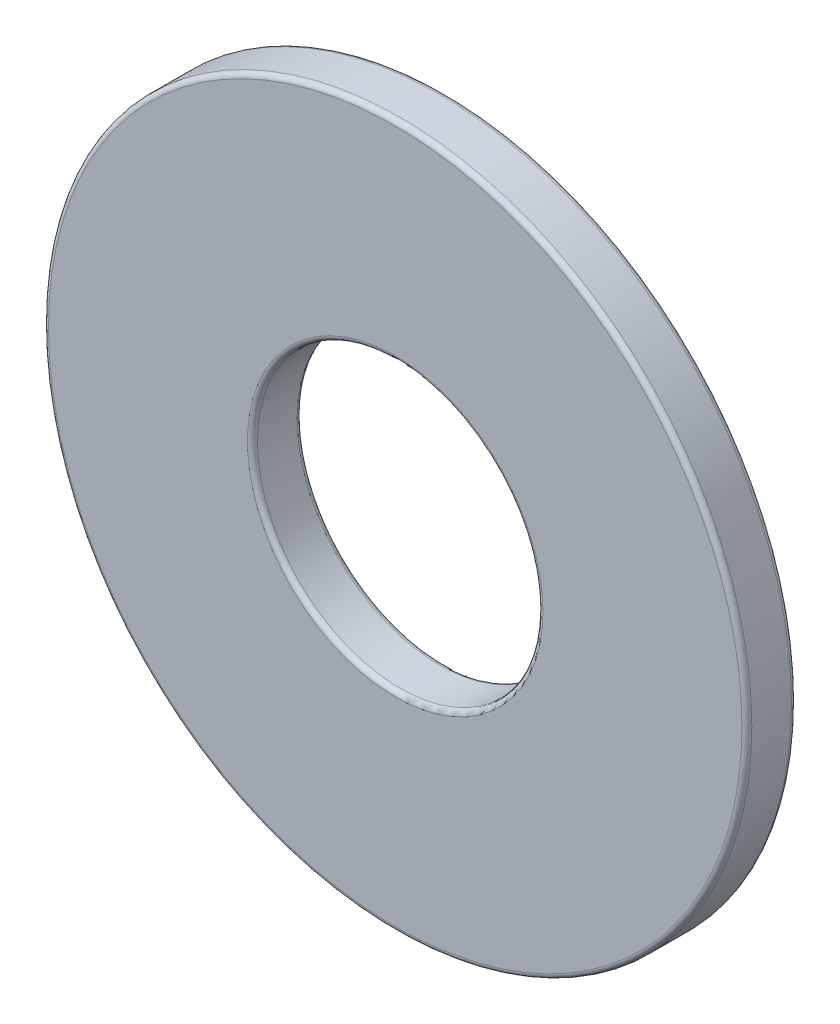
ISO-10303-21;
HEADER;
FILE_DESCRIPTION(('STEP AP214'),'2;1');
FILE_NAME('part.step','',(''),(''),'','','');
FILE_SCHEMA(('AUTOMOTIVE_DESIGN { 1 0 10303 214 1 1 1 1 }'));
ENDSEC;
DATA;
#1=APPLICATION_CONTEXT('core data for automotive mechanical design processes');
#2=APPLICATION_PROTOCOL_DEFINITION('international standard','automotive_design',2000,#1);
#3=PRODUCT_CONTEXT('',#1,'mechanical');
#4=PRODUCT('Part','Part','',(#3));
#5=PRODUCT_RELATED_PRODUCT_CATEGORY('part','',(#4));
#6=PRODUCT_DEFINITION_FORMATION('','',#4);
#7=PRODUCT_DEFINITION_CONTEXT('part definition',#1,'design');
#8=PRODUCT_DEFINITION('design','',#6,#7);
#9=PRODUCT_DEFINITION_SHAPE('','',#8);
#10=(LENGTH_UNIT() NAMED_UNIT(*) SI_UNIT(.MILLI.,.METRE.));
#11=(NAMED_UNIT(*) PLANE_ANGLE_UNIT() SI_UNIT($,.RADIAN.));
#12=(NAMED_UNIT(*) SI_UNIT($,.STERADIAN.) SOLID_ANGLE_UNIT());
#13=UNCERTAINTY_MEASURE_WITH_UNIT(LENGTH_MEASURE(1.E-05),#10,'distance_accuracy_value','');
#14=(GEOMETRIC_REPRESENTATION_CONTEXT(3) GLOBAL_UNCERTAINTY_ASSIGNED_CONTEXT((#13)) GLOBAL_UNIT_ASSIGNED_CONTEXT((#10,
#11,#12)) REPRESENTATION_CONTEXT('',''));
#15=CARTESIAN_POINT('',(0.,0.,0.));
#16=DIRECTION('',(0.,0.,1.));
#17=DIRECTION('',(1.,0.,0.));
#18=AXIS2_PLACEMENT_3D('',#15,#16,#17);
#19=CARTESIAN_POINT('',(0.,0.,-1.7907));
#20=DIRECTION('',(0.,0.,1.));
#21=DIRECTION('',(1.,0.,0.));
#22=AXIS2_PLACEMENT_3D('',#19,#20,#21);
#23=CYLINDRICAL_SURFACE('',#22,25.4);
#24=CARTESIAN_POINT('',(0.,0.,-1.43256));
#25=DIRECTION('',(0.,0.,1.));
#26=DIRECTION('',(1.,0.,0.));
#27=AXIS2_PLACEMENT_3D('',#24,#25,#26);
#28=CIRCLE('',#27,25.4);
#29=CARTESIAN_POINT('',(25.4,0.,-1.43256));
#30=VERTEX_POINT('',#29);
#31=EDGE_CURVE('E63',#30,#30,#28,.T.);
#32=CARTESIAN_POINT('',(0.,0.,1.43256));
#33=DIRECTION('',(0.,0.,1.));
#34=DIRECTION('',(1.,0.,0.));
#35=AXIS2_PLACEMENT_3D('',#32,#33,#34);
#36=CIRCLE('',#35,25.4);
#37=CARTESIAN_POINT('',(25.4,0.,1.43256));
#38=VERTEX_POINT('',#37);
#39=EDGE_CURVE('E66',#38,#38,#36,.F.);
#40=CARTESIAN_POINT('',(25.4,0.,-1.43256));
#41=CARTESIAN_POINT('',(25.4,0.,-1.402715));
#42=CARTESIAN_POINT('',(25.4,0.,-1.37287));
#43=CARTESIAN_POINT('',(25.4,0.,-1.31318));
#44=CARTESIAN_POINT('',(25.4,0.,-1.283335));
#45=CARTESIAN_POINT('',(25.4,0.,-1.223645));
#46=CARTESIAN_POINT('',(25.4,0.,-1.1938));
#47=CARTESIAN_POINT('',(25.4,0.,-1.13411));
#48=CARTESIAN_POINT('',(25.4,0.,-1.104265));
#49=CARTESIAN_POINT('',(25.4,0.,-1.044575));
#50=CARTESIAN_POINT('',(25.4,0.,-1.01473));
#51=CARTESIAN_POINT('',(25.4,0.,-0.955040000000003));
#52=CARTESIAN_POINT('',(25.4,0.,-0.925195000000003));
#53=CARTESIAN_POINT('',(25.4,0.,-0.865505000000003));
#54=CARTESIAN_POINT('',(25.4,0.,-0.835660000000003));
#55=CARTESIAN_POINT('',(25.4,0.,-0.775970000000003));
#56=CARTESIAN_POINT('',(25.4,0.,-0.746125000000003));
#57=CARTESIAN_POINT('',(25.4,0.,-0.686435000000003));
#58=CARTESIAN_POINT('',(25.4,0.,-0.656590000000003));
#59=CARTESIAN_POINT('',(25.4,0.,-0.596900000000003));
#60=CARTESIAN_POINT('',(25.4,0.,-0.567055000000003));
#61=CARTESIAN_POINT('',(25.4,0.,-0.507365000000003));
#62=CARTESIAN_POINT('',(25.4,0.,-0.477520000000003));
#63=CARTESIAN_POINT('',(25.4,0.,-0.417830000000003));
#64=CARTESIAN_POINT('',(25.4,0.,-0.387985000000003));
#65=CARTESIAN_POINT('',(25.4,0.,-0.328295000000003));
#66=CARTESIAN_POINT('',(25.4,0.,-0.298450000000003));
#67=CARTESIAN_POINT('',(25.4,0.,-0.238760000000003));
#68=CARTESIAN_POINT('',(25.4,0.,-0.208915000000003));
#69=CARTESIAN_POINT('',(25.4,0.,-0.149225000000003));
#70=CARTESIAN_POINT('',(25.4,0.,-0.119380000000003));
#71=CARTESIAN_POINT('',(25.4,0.,-0.0596900000000028));
#72=CARTESIAN_POINT('',(25.4,0.,-0.0298450000000028));
#73=CARTESIAN_POINT('',(25.4,0.,0.0298449999999972));
#74=CARTESIAN_POINT('',(25.4,0.,0.0596899999999972));
#75=CARTESIAN_POINT('',(25.4,0.,0.119379999999997));
#76=CARTESIAN_POINT('',(25.4,0.,0.149224999999997));
#77=CARTESIAN_POINT('',(25.4,0.,0.208914999999997));
#78=CARTESIAN_POINT('',(25.4,0.,0.238759999999997));
#79=CARTESIAN_POINT('',(25.4,0.,0.298449999999997));
#80=CARTESIAN_POINT('',(25.4,0.,0.328294999999997));
#81=CARTESIAN_POINT('',(25.4,0.,0.387984999999997));
#82=CARTESIAN_POINT('',(25.4,0.,0.417829999999997));
#83=CARTESIAN_POINT('',(25.4,0.,0.477519999999997));
#84=CARTESIAN_POINT('',(25.4,0.,0.507364999999997));
#85=CARTESIAN_POINT('',(25.4,0.,0.567054999999997));
#86=CARTESIAN_POINT('',(25.4,0.,0.596899999999997));
#87=CARTESIAN_POINT('',(25.4,0.,0.656589999999997));
#88=CARTESIAN_POINT('',(25.4,0.,0.686434999999997));
#89=CARTESIAN_POINT('',(25.4,0.,0.746124999999997));
#90=CARTESIAN_POINT('',(25.4,0.,0.775969999999997));
#91=CARTESIAN_POINT('',(25.4,0.,0.835659999999997));
#92=CARTESIAN_POINT('',(25.4,0.,0.865504999999997));
#93=CARTESIAN_POINT('',(25.4,0.,0.925194999999997));
#94=CARTESIAN_POINT('',(25.4,0.,0.955039999999997));
#95=CARTESIAN_POINT('',(25.4,0.,1.01473));
#96=CARTESIAN_POINT('',(25.4,0.,1.044575));
#97=CARTESIAN_POINT('',(25.4,0.,1.104265));
#98=CARTESIAN_POINT('',(25.4,0.,1.13411));
#99=CARTESIAN_POINT('',(25.4,0.,1.1938));
#100=CARTESIAN_POINT('',(25.4,0.,1.223645));
#101=CARTESIAN_POINT('',(25.4,0.,1.283335));
#102=CARTESIAN_POINT('',(25.4,0.,1.31318));
#103=CARTESIAN_POINT('',(25.4,0.,1.37287));
#104=CARTESIAN_POINT('',(25.4,0.,1.402715));
#105=CARTESIAN_POINT('',(25.4,0.,1.43256));
#106=B_SPLINE_CURVE_WITH_KNOTS('',3,(#40,#41,#42,#43,#44,#45,#46,#47,#48,#49,#50,#51,#52,#53,
#54,#55,#56,#57,#58,#59,#60,#61,#62,#63,#64,#65,#66,#67,#68,#69,#70,#71,#72,#73,#74,#75,#76,#77,
#78,#79,#80,#81,#82,#83,#84,#85,#86,#87,#88,#89,#90,#91,#92,#93,#94,#95,#96,#97,#98,#99,#100,
#101,#102,#103,#104,#105),.UNSPECIFIED.,.F.,.F.,(4,2,2,2,2,2,2,2,2,2,2,2,2,2,2,2,2,2,2,2,2,2,2,
2,2,2,2,2,2,2,2,2,4),(0.,0.089535,0.17907,0.268605,0.35814,0.447675,0.53721,0.626745,0.71628,
0.805815,0.89535,0.984885,1.07442,1.163955,1.25349,1.343025,1.43256,1.522095,1.61163,1.701165,
1.7907,1.880235,1.96977,2.059305,2.14884,2.238375,2.32791,2.417445,2.50698,2.596515,2.68605,
2.775585,2.86512),.UNSPECIFIED.);
#107=EDGE_CURVE('BSEAM37',#30,#38,#106,.T.);
#108=ORIENTED_EDGE('',*,*,#31,.T.);
#109=ORIENTED_EDGE('',*,*,#39,.T.);
#110=ORIENTED_EDGE('',*,*,#107,.T.);
#111=ORIENTED_EDGE('',*,*,#107,.F.);
#112=EDGE_LOOP('',(#108,#110,#109,#111));
#113=FACE_BOUND('',#112,.T.);
#114=ADVANCED_FACE('F37',(#113),#23,.T.);
#115=CARTESIAN_POINT('',(0.,0.,-1.7907));
#116=DIRECTION('',(0.,0.,1.));
#117=DIRECTION('',(1.,0.,0.));
#118=AXIS2_PLACEMENT_3D('',#115,#116,#117);
#119=PLANE('',#118);
#120=CARTESIAN_POINT('',(0.,0.,-1.7907));
#121=DIRECTION('',(0.,0.,1.));
#122=DIRECTION('',(1.,0.,0.));
#123=AXIS2_PLACEMENT_3D('',#120,#121,#122);
#124=CIRCLE('',#123,25.04186);
#125=CARTESIAN_POINT('',(25.04186,0.,-1.7907));
#126=VERTEX_POINT('',#125);
#127=EDGE_CURVE('E57',#126,#126,#124,.F.);
#128=ORIENTED_EDGE('',*,*,#127,.T.);
#129=EDGE_LOOP('',(#128));
#130=FACE_BOUND('',#129,.T.);
#131=CARTESIAN_POINT('',(0.,0.,-1.7907));
#132=DIRECTION('',(0.,0.,1.));
#133=DIRECTION('',(1.,0.,0.));
#134=AXIS2_PLACEMENT_3D('',#131,#132,#133);
#135=CIRCLE('',#134,10.67054);
#136=CARTESIAN_POINT('',(10.67054,0.,-1.7907));
#137=VERTEX_POINT('',#136);
#138=EDGE_CURVE('E60',#137,#137,#135,.T.);
#139=ORIENTED_EDGE('',*,*,#138,.T.);
#140=EDGE_LOOP('',(#139));
#141=FACE_BOUND('',#140,.T.);
#142=ADVANCED_FACE('F80',(#130,#141),#119,.F.);
#143=CARTESIAN_POINT('',(0.,0.,-1.7907));
#144=DIRECTION('',(0.,0.,1.));
#145=DIRECTION('',(1.,0.,0.));
#146=AXIS2_PLACEMENT_3D('',#143,#144,#145);
#147=CYLINDRICAL_SURFACE('',#146,10.3124);
#148=CARTESIAN_POINT('',(0.,0.,-1.43256));
#149=DIRECTION('',(0.,0.,1.));
#150=DIRECTION('',(1.,0.,0.));
#151=AXIS2_PLACEMENT_3D('',#148,#149,#150);
#152=CIRCLE('',#151,10.3124);
#153=CARTESIAN_POINT('',(10.3124,0.,-1.43256));
#154=VERTEX_POINT('',#153);
#155=EDGE_CURVE('E48',#154,#154,#152,.F.);
#156=CARTESIAN_POINT('',(0.,0.,1.43256));
#157=DIRECTION('',(0.,0.,1.));
#158=DIRECTION('',(1.,0.,0.));
#159=AXIS2_PLACEMENT_3D('',#156,#157,#158);
#160=CIRCLE('',#159,10.3124);
#161=CARTESIAN_POINT('',(10.3124,0.,1.43256));
#162=VERTEX_POINT('',#161);
#163=EDGE_CURVE('E52',#162,#162,#160,.T.);
#164=CARTESIAN_POINT('',(10.3124,0.,-1.43256));
#165=CARTESIAN_POINT('',(10.3124,0.,-1.402715));
#166=CARTESIAN_POINT('',(10.3124,0.,-1.37287));
#167=CARTESIAN_POINT('',(10.3124,0.,-1.31318));
#168=CARTESIAN_POINT('',(10.3124,0.,-1.283335));
#169=CARTESIAN_POINT('',(10.3124,0.,-1.223645));
#170=CARTESIAN_POINT('',(10.3124,0.,-1.1938));
#171=CARTESIAN_POINT('',(10.3124,0.,-1.13411));
#172=CARTESIAN_POINT('',(10.3124,0.,-1.104265));
#173=CARTESIAN_POINT('',(10.3124,0.,-1.044575));
#174=CARTESIAN_POINT('',(10.3124,0.,-1.01473));
#175=CARTESIAN_POINT('',(10.3124,0.,-0.955040000000003));
#176=CARTESIAN_POINT('',(10.3124,0.,-0.925195000000003));
#177=CARTESIAN_POINT('',(10.3124,0.,-0.865505000000003));
#178=CARTESIAN_POINT('',(10.3124,0.,-0.835660000000003));
#179=CARTESIAN_POINT('',(10.3124,0.,-0.775970000000003));
#180=CARTESIAN_POINT('',(10.3124,0.,-0.746125000000003));
#181=CARTESIAN_POINT('',(10.3124,0.,-0.686435000000003));
#182=CARTESIAN_POINT('',(10.3124,0.,-0.656590000000003));
#183=CARTESIAN_POINT('',(10.3124,0.,-0.596900000000003));
#184=CARTESIAN_POINT('',(10.3124,0.,-0.567055000000003));
#185=CARTESIAN_POINT('',(10.3124,0.,-0.507365000000003));
#186=CARTESIAN_POINT('',(10.3124,0.,-0.477520000000003));
#187=CARTESIAN_POINT('',(10.3124,0.,-0.417830000000003));
#188=CARTESIAN_POINT('',(10.3124,0.,-0.387985000000003));
#189=CARTESIAN_POINT('',(10.3124,0.,-0.328295000000003));
#190=CARTESIAN_POINT('',(10.3124,0.,-0.298450000000003));
#191=CARTESIAN_POINT('',(10.3124,0.,-0.238760000000003));
#192=CARTESIAN_POINT('',(10.3124,0.,-0.208915000000003));
#193=CARTESIAN_POINT('',(10.3124,0.,-0.149225000000003));
#194=CARTESIAN_POINT('',(10.3124,0.,-0.119380000000003));
#195=CARTESIAN_POINT('',(10.3124,0.,-0.0596900000000028));
#196=CARTESIAN_POINT('',(10.3124,0.,-0.0298450000000028));
#197=CARTESIAN_POINT('',(10.3124,0.,0.0298449999999972));
#198=CARTESIAN_POINT('',(10.3124,0.,0.0596899999999972));
#199=CARTESIAN_POINT('',(10.3124,0.,0.119379999999997));
#200=CARTESIAN_POINT('',(10.3124,0.,0.149224999999997));
#201=CARTESIAN_POINT('',(10.3124,0.,0.208914999999997));
#202=CARTESIAN_POINT('',(10.3124,0.,0.238759999999997));
#203=CARTESIAN_POINT('',(10.3124,0.,0.298449999999997));
#204=CARTESIAN_POINT('',(10.3124,0.,0.328294999999997));
#205=CARTESIAN_POINT('',(10.3124,0.,0.387984999999997));
#206=CARTESIAN_POINT('',(10.3124,0.,0.417829999999997));
#207=CARTESIAN_POINT('',(10.3124,0.,0.477519999999997));
#208=CARTESIAN_POINT('',(10.3124,0.,0.507364999999997));
#209=CARTESIAN_POINT('',(10.3124,0.,0.567054999999997));
#210=CARTESIAN_POINT('',(10.3124,0.,0.596899999999997));
#211=CARTESIAN_POINT('',(10.3124,0.,0.656589999999997));
#212=CARTESIAN_POINT('',(10.3124,0.,0.686434999999997));
#213=CARTESIAN_POINT('',(10.3124,0.,0.746124999999997));
#214=CARTESIAN_POINT('',(10.3124,0.,0.775969999999997));
#215=CARTESIAN_POINT('',(10.3124,0.,0.835659999999997));
#216=CARTESIAN_POINT('',(10.3124,0.,0.865504999999997));
#217=CARTESIAN_POINT('',(10.3124,0.,0.925194999999997));
#218=CARTESIAN_POINT('',(10.3124,0.,0.955039999999997));
#219=CARTESIAN_POINT('',(10.3124,0.,1.01473));
#220=CARTESIAN_POINT('',(10.3124,0.,1.044575));
#221=CARTESIAN_POINT('',(10.3124,0.,1.104265));
#222=CARTESIAN_POINT('',(10.3124,0.,1.13411));
#223=CARTESIAN_POINT('',(10.3124,0.,1.1938));
#224=CARTESIAN_POINT('',(10.3124,0.,1.223645));
#225=CARTESIAN_POINT('',(10.3124,0.,1.283335));
#226=CARTESIAN_POINT('',(10.3124,0.,1.31318));
#227=CARTESIAN_POINT('',(10.3124,0.,1.37287));
#228=CARTESIAN_POINT('',(10.3124,0.,1.402715));
#229=CARTESIAN_POINT('',(10.3124,0.,1.43256));
#230=B_SPLINE_CURVE_WITH_KNOTS('',3,(#164,#165,#166,#167,#168,#169,#170,#171,#172,#173,#174,
#175,#176,#177,#178,#179,#180,#181,#182,#183,#184,#185,#186,#187,#188,#189,#190,#191,#192,#193,
#194,#195,#196,#197,#198,#199,#200,#201,#202,#203,#204,#205,#206,#207,#208,#209,#210,#211,#212,
#213,#214,#215,#216,#217,#218,#219,#220,#221,#222,#223,#224,#225,#226,#227,#228,#229),
.UNSPECIFIED.,.F.,.F.,(4,2,2,2,2,2,2,2,2,2,2,2,2,2,2,2,2,2,2,2,2,2,2,2,2,2,2,2,2,2,2,2,4),(0.,
0.089535,0.17907,0.268605,0.35814,0.447675,0.53721,0.626745,0.71628,0.805815,0.89535,0.984885,
1.07442,1.163955,1.25349,1.343025,1.43256,1.522095,1.61163,1.701165,1.7907,1.880235,1.96977,
2.059305,2.14884,2.238375,2.32791,2.417445,2.50698,2.596515,2.68605,2.775585,2.86512),.UNSPECIFIED.);
#231=EDGE_CURVE('BSEAM86',#154,#162,#230,.T.);
#232=ORIENTED_EDGE('',*,*,#155,.T.);
#233=ORIENTED_EDGE('',*,*,#163,.T.);
#234=ORIENTED_EDGE('',*,*,#231,.T.);
#235=ORIENTED_EDGE('',*,*,#231,.F.);
#236=EDGE_LOOP('',(#232,#234,#233,#235));
#237=FACE_BOUND('',#236,.T.);
#238=ADVANCED_FACE('F86',(#237),#147,.F.);
#239=CARTESIAN_POINT('',(0.,0.,1.7907));
#240=DIRECTION('',(0.,0.,1.));
#241=DIRECTION('',(1.,0.,0.));
#242=AXIS2_PLACEMENT_3D('',#239,#240,#241);
#243=PLANE('',#242);
#244=CARTESIAN_POINT('',(0.,0.,1.7907));
#245=DIRECTION('',(0.,0.,1.));
#246=DIRECTION('',(1.,0.,0.));
#247=AXIS2_PLACEMENT_3D('',#244,#245,#246);
#248=CIRCLE('',#247,10.67054);
#249=CARTESIAN_POINT('',(10.67054,0.,1.7907));
#250=VERTEX_POINT('',#249);
#251=EDGE_CURVE('E10',#250,#250,#248,.F.);
#252=ORIENTED_EDGE('',*,*,#251,.T.);
#253=EDGE_LOOP('',(#252));
#254=FACE_BOUND('',#253,.T.);
#255=CARTESIAN_POINT('',(0.,0.,1.7907));
#256=DIRECTION('',(0.,0.,1.));
#257=DIRECTION('',(1.,0.,0.));
#258=AXIS2_PLACEMENT_3D('',#255,#256,#257);
#259=CIRCLE('',#258,25.04186);
#260=CARTESIAN_POINT('',(25.04186,0.,1.7907));
#261=VERTEX_POINT('',#260);
#262=EDGE_CURVE('E44',#261,#261,#259,.T.);
#263=ORIENTED_EDGE('',*,*,#262,.T.);
#264=EDGE_LOOP('',(#263));
#265=FACE_BOUND('',#264,.T.);
#266=ADVANCED_FACE('F94',(#254,#265),#243,.T.);
#267=CARTESIAN_POINT('',(0.,0.,-1.43256));
#268=DIRECTION('',(0.,0.,1.));
#269=DIRECTION('',(1.,0.,0.));
#270=AXIS2_PLACEMENT_3D('',#267,#268,#269);
#271=TOROIDAL_SURFACE('',#270,25.04186,0.35814);
#272=ORIENTED_EDGE('',*,*,#127,.F.);
#273=EDGE_LOOP('',(#272));
#274=FACE_BOUND('',#273,.T.);
#275=ORIENTED_EDGE('',*,*,#31,.F.);
#276=EDGE_LOOP('',(#275));
#277=FACE_BOUND('',#276,.T.);
#278=ADVANCED_FACE('F91',(#274,#277),#271,.T.);
#279=CARTESIAN_POINT('',(0.,0.,-1.43256));
#280=DIRECTION('',(0.,0.,1.));
#281=DIRECTION('',(1.,0.,0.));
#282=AXIS2_PLACEMENT_3D('',#279,#280,#281);
#283=TOROIDAL_SURFACE('',#282,10.67054,0.35814);
#284=ORIENTED_EDGE('',*,*,#155,.F.);
#285=EDGE_LOOP('',(#284));
#286=FACE_BOUND('',#285,.T.);
#287=ORIENTED_EDGE('',*,*,#138,.F.);
#288=EDGE_LOOP('',(#287));
#289=FACE_BOUND('',#288,.T.);
#290=ADVANCED_FACE('F77',(#286,#289),#283,.T.);
#291=CARTESIAN_POINT('',(0.,0.,1.43256));
#292=DIRECTION('',(0.,0.,1.));
#293=DIRECTION('',(1.,0.,0.));
#294=AXIS2_PLACEMENT_3D('',#291,#292,#293);
#295=TOROIDAL_SURFACE('',#294,10.67054,0.35814);
#296=ORIENTED_EDGE('',*,*,#251,.F.);
#297=EDGE_LOOP('',(#296));
#298=FACE_BOUND('',#297,.T.);
#299=ORIENTED_EDGE('',*,*,#163,.F.);
#300=EDGE_LOOP('',(#299));
#301=FACE_BOUND('',#300,.T.);
#302=ADVANCED_FACE('F73',(#298,#301),#295,.T.);
#303=CARTESIAN_POINT('',(0.,0.,1.43256));
#304=DIRECTION('',(0.,0.,1.));
#305=DIRECTION('',(1.,0.,0.));
#306=AXIS2_PLACEMENT_3D('',#303,#304,#305);
#307=TOROIDAL_SURFACE('',#306,25.04186,0.35814);
#308=ORIENTED_EDGE('',*,*,#39,.F.);
#309=EDGE_LOOP('',(#308));
#310=FACE_BOUND('',#309,.T.);
#311=ORIENTED_EDGE('',*,*,#262,.F.);
#312=EDGE_LOOP('',(#311));
#313=FACE_BOUND('',#312,.T.);
#314=ADVANCED_FACE('F39',(#310,#313),#307,.T.);
#315=CLOSED_SHELL('',(#114,#142,#238,#266,#278,#290,#302,#314));
#316=MANIFOLD_SOLID_BREP('B2',#315);
#317=ADVANCED_BREP_SHAPE_REPRESENTATION('',(#18,#316),#14);
#318=SHAPE_DEFINITION_REPRESENTATION(#9,#317);
ENDSEC;
END-ISO-10303-21;
